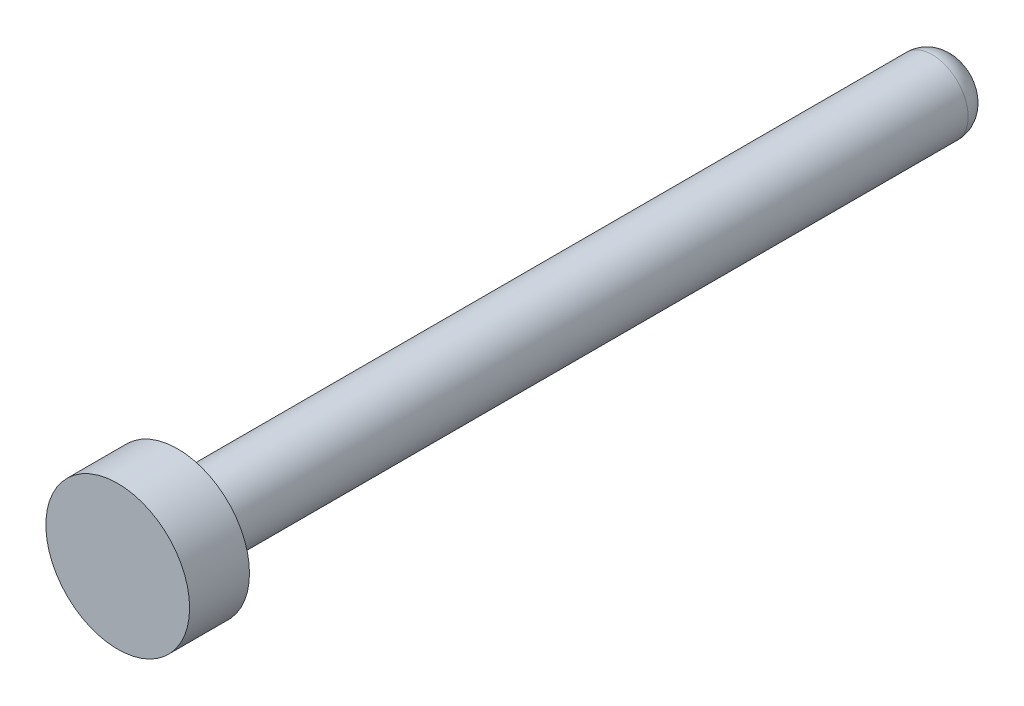
ISO-10303-21;
HEADER;
FILE_DESCRIPTION(('STEP AP214'),'2;1');
FILE_NAME('part.step','',(''),(''),'','','');
FILE_SCHEMA(('AUTOMOTIVE_DESIGN { 1 0 10303 214 1 1 1 1 }'));
ENDSEC;
DATA;
#1=APPLICATION_CONTEXT('core data for automotive mechanical design processes');
#2=APPLICATION_PROTOCOL_DEFINITION('international standard','automotive_design',2000,#1);
#3=PRODUCT_CONTEXT('',#1,'mechanical');
#4=PRODUCT('Part','Part','',(#3));
#5=PRODUCT_RELATED_PRODUCT_CATEGORY('part','',(#4));
#6=PRODUCT_DEFINITION_FORMATION('','',#4);
#7=PRODUCT_DEFINITION_CONTEXT('part definition',#1,'design');
#8=PRODUCT_DEFINITION('design','',#6,#7);
#9=PRODUCT_DEFINITION_SHAPE('','',#8);
#10=(LENGTH_UNIT() NAMED_UNIT(*) SI_UNIT(.MILLI.,.METRE.));
#11=(NAMED_UNIT(*) PLANE_ANGLE_UNIT() SI_UNIT($,.RADIAN.));
#12=(NAMED_UNIT(*) SI_UNIT($,.STERADIAN.) SOLID_ANGLE_UNIT());
#13=UNCERTAINTY_MEASURE_WITH_UNIT(LENGTH_MEASURE(1.E-05),#10,'distance_accuracy_value','');
#14=(GEOMETRIC_REPRESENTATION_CONTEXT(3) GLOBAL_UNCERTAINTY_ASSIGNED_CONTEXT((#13)) GLOBAL_UNIT_ASSIGNED_CONTEXT((#10,
#11,#12)) REPRESENTATION_CONTEXT('',''));
#15=CARTESIAN_POINT('',(0.,0.,0.));
#16=DIRECTION('',(0.,0.,1.));
#17=DIRECTION('',(1.,0.,0.));
#18=AXIS2_PLACEMENT_3D('',#15,#16,#17);
#19=CARTESIAN_POINT('',(0.,0.,65.));
#20=DIRECTION('',(0.,0.,-1.));
#21=DIRECTION('',(-1.,0.,0.));
#22=AXIS2_PLACEMENT_3D('',#19,#20,#21);
#23=CYLINDRICAL_SURFACE('',#22,3.);
#24=CARTESIAN_POINT('',(0.,0.,2.));
#25=DIRECTION('',(0.,0.,1.));
#26=DIRECTION('',(1.,0.,0.));
#27=AXIS2_PLACEMENT_3D('',#24,#25,#26);
#28=CIRCLE('',#27,3.);
#29=CARTESIAN_POINT('',(3.,0.,2.));
#30=VERTEX_POINT('',#29);
#31=EDGE_CURVE('E49',#30,#30,#28,.T.);
#32=ORIENTED_EDGE('',*,*,#31,.T.);
#33=EDGE_LOOP('',(#32));
#34=FACE_BOUND('',#33,.T.);
#35=CARTESIAN_POINT('',(0.,0.,65.));
#36=DIRECTION('',(0.,0.,1.));
#37=DIRECTION('',(1.,0.,0.));
#38=AXIS2_PLACEMENT_3D('',#35,#36,#37);
#39=CIRCLE('',#38,3.);
#40=CARTESIAN_POINT('',(3.,0.,65.));
#41=VERTEX_POINT('',#40);
#42=EDGE_CURVE('E54',#41,#41,#39,.T.);
#43=ORIENTED_EDGE('',*,*,#42,.F.);
#44=EDGE_LOOP('',(#43));
#45=FACE_BOUND('',#44,.T.);
#46=ADVANCED_FACE('F41',(#34,#45),#23,.T.);
#47=CARTESIAN_POINT('',(0.,0.,0.));
#48=DIRECTION('',(0.,0.,1.));
#49=DIRECTION('',(1.,0.,0.));
#50=AXIS2_PLACEMENT_3D('',#47,#48,#49);
#51=PLANE('',#50);
#52=CARTESIAN_POINT('',(0.,0.,0.));
#53=DIRECTION('',(0.,0.,1.));
#54=DIRECTION('',(1.,0.,0.));
#55=AXIS2_PLACEMENT_3D('',#52,#53,#54);
#56=CIRCLE('',#55,1.);
#57=CARTESIAN_POINT('',(1.,0.,0.));
#58=VERTEX_POINT('',#57);
#59=EDGE_CURVE('E10',#58,#58,#56,.F.);
#60=ORIENTED_EDGE('',*,*,#59,.T.);
#61=EDGE_LOOP('',(#60));
#62=FACE_BOUND('',#61,.T.);
#63=ADVANCED_FACE('F75',(#62),#51,.F.);
#64=CARTESIAN_POINT('',(0.,0.,70.));
#65=DIRECTION('',(0.,0.,-1.));
#66=DIRECTION('',(-1.,0.,0.));
#67=AXIS2_PLACEMENT_3D('',#64,#65,#66);
#68=CYLINDRICAL_SURFACE('',#67,6.);
#69=CARTESIAN_POINT('',(0.,0.,70.));
#70=DIRECTION('',(0.,0.,1.));
#71=DIRECTION('',(1.,0.,0.));
#72=AXIS2_PLACEMENT_3D('',#69,#70,#71);
#73=CIRCLE('',#72,6.);
#74=CARTESIAN_POINT('',(6.,0.,70.));
#75=VERTEX_POINT('',#74);
#76=EDGE_CURVE('E59',#75,#75,#73,.T.);
#77=ORIENTED_EDGE('',*,*,#76,.F.);
#78=EDGE_LOOP('',(#77));
#79=FACE_BOUND('',#78,.T.);
#80=CARTESIAN_POINT('',(0.,0.,65.));
#81=DIRECTION('',(0.,0.,1.));
#82=DIRECTION('',(1.,0.,0.));
#83=AXIS2_PLACEMENT_3D('',#80,#81,#82);
#84=CIRCLE('',#83,6.);
#85=CARTESIAN_POINT('',(6.,0.,65.));
#86=VERTEX_POINT('',#85);
#87=EDGE_CURVE('E62',#86,#86,#84,.T.);
#88=ORIENTED_EDGE('',*,*,#87,.T.);
#89=EDGE_LOOP('',(#88));
#90=FACE_BOUND('',#89,.T.);
#91=ADVANCED_FACE('F72',(#79,#90),#68,.T.);
#92=CARTESIAN_POINT('',(0.,0.,70.));
#93=DIRECTION('',(0.,0.,1.));
#94=DIRECTION('',(1.,0.,0.));
#95=AXIS2_PLACEMENT_3D('',#92,#93,#94);
#96=PLANE('',#95);
#97=ORIENTED_EDGE('',*,*,#76,.T.);
#98=EDGE_LOOP('',(#97));
#99=FACE_BOUND('',#98,.T.);
#100=ADVANCED_FACE('F70',(#99),#96,.T.);
#101=CARTESIAN_POINT('',(0.,0.,65.));
#102=DIRECTION('',(0.,0.,1.));
#103=DIRECTION('',(1.,0.,0.));
#104=AXIS2_PLACEMENT_3D('',#101,#102,#103);
#105=PLANE('',#104);
#106=ORIENTED_EDGE('',*,*,#42,.T.);
#107=EDGE_LOOP('',(#106));
#108=FACE_BOUND('',#107,.T.);
#109=ORIENTED_EDGE('',*,*,#87,.F.);
#110=EDGE_LOOP('',(#109));
#111=FACE_BOUND('',#110,.T.);
#112=ADVANCED_FACE('F79',(#108,#111),#105,.F.);
#113=CARTESIAN_POINT('',(0.,0.,2.));
#114=DIRECTION('',(0.,0.,1.));
#115=DIRECTION('',(1.,0.,0.));
#116=AXIS2_PLACEMENT_3D('',#113,#114,#115);
#117=DEGENERATE_TOROIDAL_SURFACE('',#116,1.,2.,.T.);
#118=ORIENTED_EDGE('',*,*,#59,.F.);
#119=EDGE_LOOP('',(#118));
#120=FACE_BOUND('',#119,.T.);
#121=ORIENTED_EDGE('',*,*,#31,.F.);
#122=EDGE_LOOP('',(#121));
#123=FACE_BOUND('',#122,.T.);
#124=ADVANCED_FACE('F43',(#120,#123),#117,.T.);
#125=CLOSED_SHELL('',(#46,#63,#91,#100,#112,#124));
#126=MANIFOLD_SOLID_BREP('B2',#125);
#127=ADVANCED_BREP_SHAPE_REPRESENTATION('',(#18,#126),#14);
#128=SHAPE_DEFINITION_REPRESENTATION(#9,#127);
ENDSEC;
END-ISO-10303-21;
